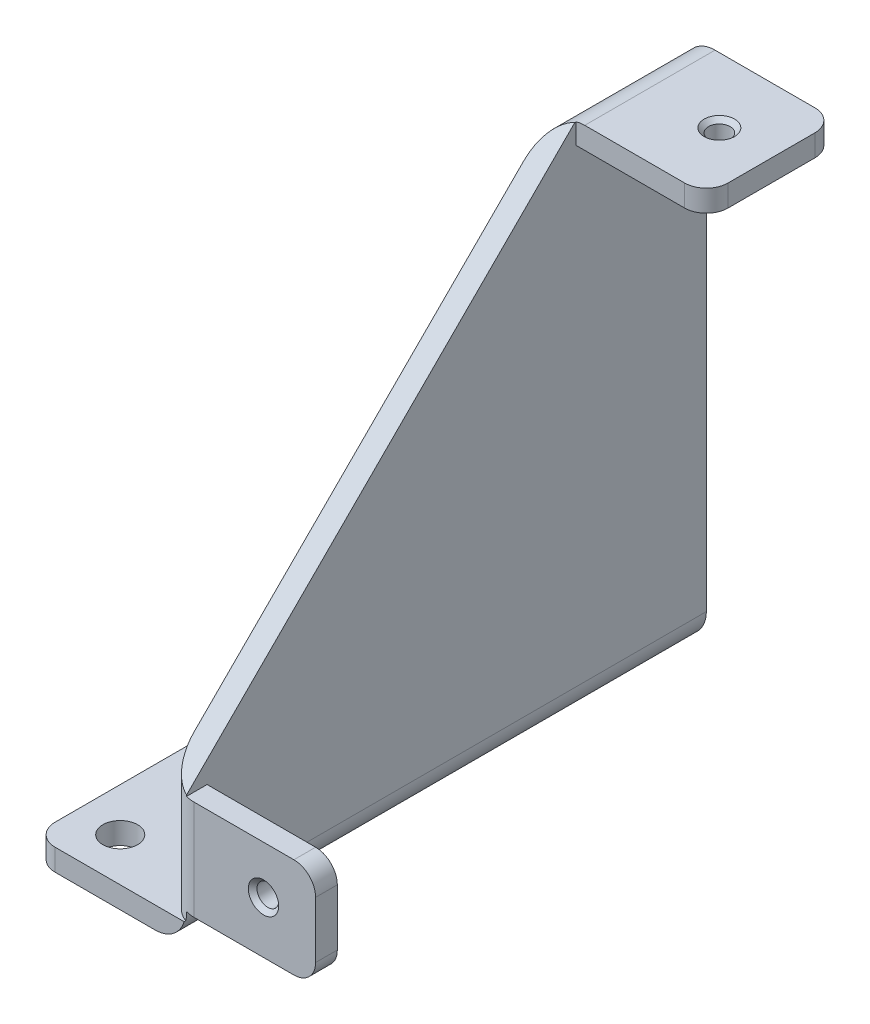
ISO-10303-21;
HEADER;
FILE_DESCRIPTION(('STEP AP214'),'2;1');
FILE_NAME('part.step','',(''),(''),'','','');
FILE_SCHEMA(('AUTOMOTIVE_DESIGN { 1 0 10303 214 1 1 1 1 }'));
ENDSEC;
DATA;
#1=APPLICATION_CONTEXT('core data for automotive mechanical design processes');
#2=APPLICATION_PROTOCOL_DEFINITION('international standard','automotive_design',2000,#1);
#3=PRODUCT_CONTEXT('',#1,'mechanical');
#4=PRODUCT('Part','Part','',(#3));
#5=PRODUCT_RELATED_PRODUCT_CATEGORY('part','',(#4));
#6=PRODUCT_DEFINITION_FORMATION('','',#4);
#7=PRODUCT_DEFINITION_CONTEXT('part definition',#1,'design');
#8=PRODUCT_DEFINITION('design','',#6,#7);
#9=PRODUCT_DEFINITION_SHAPE('','',#8);
#10=(LENGTH_UNIT() NAMED_UNIT(*) SI_UNIT(.MILLI.,.METRE.));
#11=(NAMED_UNIT(*) PLANE_ANGLE_UNIT() SI_UNIT($,.RADIAN.));
#12=(NAMED_UNIT(*) SI_UNIT($,.STERADIAN.) SOLID_ANGLE_UNIT());
#13=UNCERTAINTY_MEASURE_WITH_UNIT(LENGTH_MEASURE(1.E-05),#10,'distance_accuracy_value','');
#14=(GEOMETRIC_REPRESENTATION_CONTEXT(3) GLOBAL_UNCERTAINTY_ASSIGNED_CONTEXT((#13)) GLOBAL_UNIT_ASSIGNED_CONTEXT((#10,
#11,#12)) REPRESENTATION_CONTEXT('',''));
#15=CARTESIAN_POINT('',(0.,0.,0.));
#16=DIRECTION('',(0.,0.,1.));
#17=DIRECTION('',(1.,0.,0.));
#18=AXIS2_PLACEMENT_3D('',#15,#16,#17);
#19=CARTESIAN_POINT('',(5.,30.,120.));
#20=DIRECTION('',(0.,0.,-1.));
#21=DIRECTION('',(-1.,0.,0.));
#22=AXIS2_PLACEMENT_3D('',#19,#20,#21);
#23=PLANE('',#22);
#24=CARTESIAN_POINT('',(23.,19.,120.));
#25=DIRECTION('',(0.,0.,1.));
#26=DIRECTION('',(1.,0.,0.));
#27=AXIS2_PLACEMENT_3D('',#24,#25,#26);
#28=CIRCLE('',#27,3.5);
#29=CARTESIAN_POINT('',(26.5,19.,120.));
#30=VERTEX_POINT('',#29);
#31=EDGE_CURVE('E503',#30,#30,#28,.T.);
#32=ORIENTED_EDGE('',*,*,#31,.F.);
#33=EDGE_LOOP('',(#32));
#34=FACE_BOUND('',#33,.T.);
#35=DIRECTION('',(0.,-1.,0.));
#36=VECTOR('',#35,1.);
#37=CARTESIAN_POINT('',(35.,30.,120.));
#38=LINE('',#37,#36);
#39=CARTESIAN_POINT('',(35.,25.,120.));
#40=VERTEX_POINT('',#39);
#41=CARTESIAN_POINT('',(35.,12.,120.));
#42=VERTEX_POINT('',#41);
#43=EDGE_CURVE('E234',#40,#42,#38,.T.);
#44=ORIENTED_EDGE('',*,*,#43,.F.);
#45=CARTESIAN_POINT('',(30.,25.,120.));
#46=DIRECTION('',(0.,0.,-1.));
#47=DIRECTION('',(-1.,0.,0.));
#48=AXIS2_PLACEMENT_3D('',#45,#46,#47);
#49=CIRCLE('',#48,5.);
#50=CARTESIAN_POINT('',(30.,30.,120.));
#51=VERTEX_POINT('',#50);
#52=EDGE_CURVE('E447',#40,#51,#49,.F.);
#53=ORIENTED_EDGE('',*,*,#52,.T.);
#54=DIRECTION('',(-1.,0.,0.));
#55=VECTOR('',#54,1.);
#56=CARTESIAN_POINT('',(35.,30.,120.));
#57=LINE('',#56,#55);
#58=CARTESIAN_POINT('',(7.,30.,120.));
#59=VERTEX_POINT('',#58);
#60=EDGE_CURVE('E242',#51,#59,#57,.T.);
#61=ORIENTED_EDGE('',*,*,#60,.T.);
#62=DIRECTION('',(0.,-1.,0.));
#63=VECTOR('',#62,1.);
#64=CARTESIAN_POINT('',(7.,30.,120.));
#65=LINE('',#64,#63);
#66=CARTESIAN_POINT('',(7.,7.,120.));
#67=VERTEX_POINT('',#66);
#68=EDGE_CURVE('E271',#59,#67,#65,.T.);
#69=ORIENTED_EDGE('',*,*,#68,.T.);
#70=DIRECTION('',(-1.,0.,0.));
#71=VECTOR('',#70,1.);
#72=CARTESIAN_POINT('',(35.,7.,120.));
#73=LINE('',#72,#71);
#74=CARTESIAN_POINT('',(30.,7.,120.));
#75=VERTEX_POINT('',#74);
#76=EDGE_CURVE('E205',#75,#67,#73,.T.);
#77=ORIENTED_EDGE('',*,*,#76,.F.);
#78=CARTESIAN_POINT('',(30.,12.,120.));
#79=DIRECTION('',(0.,0.,-1.));
#80=DIRECTION('',(-1.,0.,0.));
#81=AXIS2_PLACEMENT_3D('',#78,#79,#80);
#82=CIRCLE('',#81,5.);
#83=EDGE_CURVE('E445',#75,#42,#82,.F.);
#84=ORIENTED_EDGE('',*,*,#83,.T.);
#85=EDGE_LOOP('',(#44,#53,#61,#69,#77,#84));
#86=FACE_BOUND('',#85,.T.);
#87=ADVANCED_FACE('F38',(#34,#86),#23,.F.);
#88=CARTESIAN_POINT('',(5.,0.,0.));
#89=DIRECTION('',(1.,0.,0.));
#90=DIRECTION('',(0.,0.,-1.));
#91=AXIS2_PLACEMENT_3D('',#88,#89,#90);
#92=PLANE('',#91);
#93=DIRECTION('',(0.,-1.,0.));
#94=VECTOR('',#93,1.);
#95=CARTESIAN_POINT('',(5.,120.,30.));
#96=LINE('',#95,#94);
#97=CARTESIAN_POINT('',(5.,119.708203932499,30.));
#98=VERTEX_POINT('',#97);
#99=CARTESIAN_POINT('',(5.,115.,30.));
#100=VERTEX_POINT('',#99);
#101=EDGE_CURVE('E485',#98,#100,#96,.T.);
#102=ORIENTED_EDGE('',*,*,#101,.F.);
#103=DIRECTION('',(0.,0.,1.));
#104=VECTOR('',#103,1.);
#105=CARTESIAN_POINT('',(5.,119.708203932499,30.));
#106=LINE('',#105,#104);
#107=CARTESIAN_POINT('',(5.,119.708203932499,30.2917960675006));
#108=VERTEX_POINT('',#107);
#109=EDGE_CURVE('E385',#98,#108,#106,.T.);
#110=ORIENTED_EDGE('',*,*,#109,.T.);
#111=DIRECTION('',(0.,-0.707106781186548,0.707106781186548));
#112=VECTOR('',#111,1.);
#113=CARTESIAN_POINT('',(5.,120.,30.));
#114=LINE('',#113,#112);
#115=CARTESIAN_POINT('',(5.,30.2917960675007,119.708203932499));
#116=VERTEX_POINT('',#115);
#117=EDGE_CURVE('E394',#108,#116,#114,.T.);
#118=ORIENTED_EDGE('',*,*,#117,.T.);
#119=DIRECTION('',(0.,-1.,0.));
#120=VECTOR('',#119,1.);
#121=CARTESIAN_POINT('',(5.,30.2917960675006,119.708203932499));
#122=LINE('',#121,#120);
#123=CARTESIAN_POINT('',(5.,30.,119.708203932499));
#124=VERTEX_POINT('',#123);
#125=EDGE_CURVE('E383',#116,#124,#122,.T.);
#126=ORIENTED_EDGE('',*,*,#125,.T.);
#127=DIRECTION('',(0.,0.,1.));
#128=VECTOR('',#127,1.);
#129=CARTESIAN_POINT('',(5.,30.,120.));
#130=LINE('',#129,#128);
#131=CARTESIAN_POINT('',(5.,30.,115.));
#132=VERTEX_POINT('',#131);
#133=EDGE_CURVE('E231',#132,#124,#130,.T.);
#134=ORIENTED_EDGE('',*,*,#133,.F.);
#135=DIRECTION('',(0.,1.,0.));
#136=VECTOR('',#135,1.);
#137=CARTESIAN_POINT('',(5.,30.,115.));
#138=LINE('',#137,#136);
#139=CARTESIAN_POINT('',(5.,7.,115.));
#140=VERTEX_POINT('',#139);
#141=EDGE_CURVE('E200',#140,#132,#138,.T.);
#142=ORIENTED_EDGE('',*,*,#141,.F.);
#143=DIRECTION('',(0.,0.,-1.));
#144=VECTOR('',#143,1.);
#145=CARTESIAN_POINT('',(5.,7.,0.));
#146=LINE('',#145,#144);
#147=CARTESIAN_POINT('',(5.,7.,0.));
#148=VERTEX_POINT('',#147);
#149=EDGE_CURVE('E218',#140,#148,#146,.T.);
#150=ORIENTED_EDGE('',*,*,#149,.T.);
#151=DIRECTION('',(0.,1.,0.));
#152=VECTOR('',#151,1.);
#153=CARTESIAN_POINT('',(5.,0.,0.));
#154=LINE('',#153,#152);
#155=CARTESIAN_POINT('',(5.,115.,0.));
#156=VERTEX_POINT('',#155);
#157=EDGE_CURVE('E256',#148,#156,#154,.T.);
#158=ORIENTED_EDGE('',*,*,#157,.T.);
#159=DIRECTION('',(0.,0.,-1.));
#160=VECTOR('',#159,1.);
#161=CARTESIAN_POINT('',(5.,115.,0.));
#162=LINE('',#161,#160);
#163=EDGE_CURVE('E481',#100,#156,#162,.T.);
#164=ORIENTED_EDGE('',*,*,#163,.F.);
#165=EDGE_LOOP('',(#102,#110,#118,#126,#134,#142,#150,#158,#164));
#166=FACE_BOUND('',#165,.T.);
#167=ADVANCED_FACE('F229',(#166),#92,.T.);
#168=CARTESIAN_POINT('',(0.,0.,0.));
#169=DIRECTION('',(1.,0.,0.));
#170=DIRECTION('',(0.,0.,-1.));
#171=AXIS2_PLACEMENT_3D('',#168,#169,#170);
#172=PLANE('',#171);
#173=DIRECTION('',(0.,-0.707106781186548,0.707106781186548));
#174=VECTOR('',#173,1.);
#175=CARTESIAN_POINT('',(0.,120.,30.));
#176=LINE('',#175,#174);
#177=CARTESIAN_POINT('',(0.,113.,37.));
#178=VERTEX_POINT('',#177);
#179=CARTESIAN_POINT('',(0.,37.,113.));
#180=VERTEX_POINT('',#179);
#181=EDGE_CURVE('E393',#178,#180,#176,.T.);
#182=ORIENTED_EDGE('',*,*,#181,.F.);
#183=DIRECTION('',(0.,0.,1.));
#184=VECTOR('',#183,1.);
#185=CARTESIAN_POINT('',(0.,113.,0.));
#186=LINE('',#185,#184);
#187=CARTESIAN_POINT('',(0.,113.,0.));
#188=VERTEX_POINT('',#187);
#189=EDGE_CURVE('E266',#178,#188,#186,.F.);
#190=ORIENTED_EDGE('',*,*,#189,.T.);
#191=DIRECTION('',(0.,1.,0.));
#192=VECTOR('',#191,1.);
#193=CARTESIAN_POINT('',(0.,0.,0.));
#194=LINE('',#193,#192);
#195=CARTESIAN_POINT('',(0.,5.,0.));
#196=VERTEX_POINT('',#195);
#197=EDGE_CURVE('E351',#196,#188,#194,.T.);
#198=ORIENTED_EDGE('',*,*,#197,.F.);
#199=DIRECTION('',(0.,0.,-1.));
#200=VECTOR('',#199,1.);
#201=CARTESIAN_POINT('',(0.,5.,0.));
#202=LINE('',#201,#200);
#203=CARTESIAN_POINT('',(0.,5.,113.));
#204=VERTEX_POINT('',#203);
#205=EDGE_CURVE('E246',#204,#196,#202,.T.);
#206=ORIENTED_EDGE('',*,*,#205,.F.);
#207=DIRECTION('',(0.,-1.,0.));
#208=VECTOR('',#207,1.);
#209=CARTESIAN_POINT('',(0.,0.,113.));
#210=LINE('',#209,#208);
#211=EDGE_CURVE('E264',#204,#180,#210,.F.);
#212=ORIENTED_EDGE('',*,*,#211,.T.);
#213=EDGE_LOOP('',(#182,#190,#198,#206,#212));
#214=FACE_BOUND('',#213,.T.);
#215=ADVANCED_FACE('F329',(#214),#172,.F.);
#216=CARTESIAN_POINT('',(5.,0.,120.));
#217=DIRECTION('',(0.,1.,0.));
#218=DIRECTION('',(0.,0.,1.));
#219=AXIS2_PLACEMENT_3D('',#216,#217,#218);
#220=PLANE('',#219);
#221=CARTESIAN_POINT('',(-20.,0.,110.));
#222=DIRECTION('',(0.,1.,0.));
#223=DIRECTION('',(0.,0.,1.));
#224=AXIS2_PLACEMENT_3D('',#221,#222,#223);
#225=CIRCLE('',#224,4.);
#226=CARTESIAN_POINT('',(-20.,0.,114.));
#227=VERTEX_POINT('',#226);
#228=EDGE_CURVE('E510',#227,#227,#225,.T.);
#229=ORIENTED_EDGE('',*,*,#228,.T.);
#230=EDGE_LOOP('',(#229));
#231=FACE_BOUND('',#230,.T.);
#232=CARTESIAN_POINT('',(-20.,0.,9.99999999999999));
#233=DIRECTION('',(0.,1.,0.));
#234=DIRECTION('',(0.,0.,1.));
#235=AXIS2_PLACEMENT_3D('',#232,#233,#234);
#236=CIRCLE('',#235,4.);
#237=CARTESIAN_POINT('',(-20.,0.,14.));
#238=VERTEX_POINT('',#237);
#239=EDGE_CURVE('E506',#238,#238,#236,.T.);
#240=ORIENTED_EDGE('',*,*,#239,.T.);
#241=EDGE_LOOP('',(#240));
#242=FACE_BOUND('',#241,.T.);
#243=DIRECTION('',(0.,0.,1.));
#244=VECTOR('',#243,1.);
#245=CARTESIAN_POINT('',(-30.,0.,0.));
#246=LINE('',#245,#244);
#247=CARTESIAN_POINT('',(-30.,0.,5.));
#248=VERTEX_POINT('',#247);
#249=CARTESIAN_POINT('',(-30.,0.,115.));
#250=VERTEX_POINT('',#249);
#251=EDGE_CURVE('E247',#248,#250,#246,.T.);
#252=ORIENTED_EDGE('',*,*,#251,.F.);
#253=CARTESIAN_POINT('',(-25.,0.,5.));
#254=DIRECTION('',(0.,1.,0.));
#255=DIRECTION('',(0.,0.,1.));
#256=AXIS2_PLACEMENT_3D('',#253,#254,#255);
#257=CIRCLE('',#256,5.);
#258=CARTESIAN_POINT('',(-25.,0.,0.));
#259=VERTEX_POINT('',#258);
#260=EDGE_CURVE('E360',#248,#259,#257,.F.);
#261=ORIENTED_EDGE('',*,*,#260,.T.);
#262=DIRECTION('',(-1.,0.,0.));
#263=VECTOR('',#262,1.);
#264=CARTESIAN_POINT('',(5.,0.,0.));
#265=LINE('',#264,#263);
#266=CARTESIAN_POINT('',(-2.,0.,0.));
#267=VERTEX_POINT('',#266);
#268=EDGE_CURVE('E226',#267,#259,#265,.T.);
#269=ORIENTED_EDGE('',*,*,#268,.F.);
#270=DIRECTION('',(0.,0.,-1.));
#271=VECTOR('',#270,1.);
#272=CARTESIAN_POINT('',(-2.,0.,120.));
#273=LINE('',#272,#271);
#274=CARTESIAN_POINT('',(-2.,0.,120.));
#275=VERTEX_POINT('',#274);
#276=EDGE_CURVE('E375',#267,#275,#273,.F.);
#277=ORIENTED_EDGE('',*,*,#276,.T.);
#278=DIRECTION('',(-1.,0.,0.));
#279=VECTOR('',#278,1.);
#280=CARTESIAN_POINT('',(5.,0.,120.));
#281=LINE('',#280,#279);
#282=CARTESIAN_POINT('',(-25.,0.,120.));
#283=VERTEX_POINT('',#282);
#284=EDGE_CURVE('E418',#275,#283,#281,.T.);
#285=ORIENTED_EDGE('',*,*,#284,.T.);
#286=CARTESIAN_POINT('',(-25.,0.,115.));
#287=DIRECTION('',(0.,1.,0.));
#288=DIRECTION('',(0.,0.,1.));
#289=AXIS2_PLACEMENT_3D('',#286,#287,#288);
#290=CIRCLE('',#289,5.);
#291=EDGE_CURVE('E356',#283,#250,#290,.F.);
#292=ORIENTED_EDGE('',*,*,#291,.T.);
#293=EDGE_LOOP('',(#252,#261,#269,#277,#285,#292));
#294=FACE_BOUND('',#293,.T.);
#295=ADVANCED_FACE('F519',(#231,#242,#294),#220,.F.);
#296=CARTESIAN_POINT('',(5.,0.,0.));
#297=DIRECTION('',(0.,0.,1.));
#298=DIRECTION('',(1.,0.,0.));
#299=AXIS2_PLACEMENT_3D('',#296,#297,#298);
#300=PLANE('',#299);
#301=DIRECTION('',(-1.,0.,0.));
#302=VECTOR('',#301,1.);
#303=CARTESIAN_POINT('',(5.,120.,0.));
#304=LINE('',#303,#302);
#305=CARTESIAN_POINT('',(30.,120.,0.));
#306=VERTEX_POINT('',#305);
#307=CARTESIAN_POINT('',(7.,120.,0.));
#308=VERTEX_POINT('',#307);
#309=EDGE_CURVE('E410',#306,#308,#304,.T.);
#310=ORIENTED_EDGE('',*,*,#309,.F.);
#311=DIRECTION('',(0.,1.,0.));
#312=VECTOR('',#311,1.);
#313=CARTESIAN_POINT('',(30.,0.,0.));
#314=LINE('',#313,#312);
#315=CARTESIAN_POINT('',(30.,115.,0.));
#316=VERTEX_POINT('',#315);
#317=EDGE_CURVE('E425',#306,#316,#314,.F.);
#318=ORIENTED_EDGE('',*,*,#317,.T.);
#319=DIRECTION('',(-1.,0.,0.));
#320=VECTOR('',#319,1.);
#321=CARTESIAN_POINT('',(35.,115.,0.));
#322=LINE('',#321,#320);
#323=EDGE_CURVE('E478',#316,#156,#322,.T.);
#324=ORIENTED_EDGE('',*,*,#323,.T.);
#325=ORIENTED_EDGE('',*,*,#157,.F.);
#326=CARTESIAN_POINT('',(-2.,7.,0.));
#327=DIRECTION('',(0.,0.,1.));
#328=DIRECTION('',(1.,0.,0.));
#329=AXIS2_PLACEMENT_3D('',#326,#327,#328);
#330=CIRCLE('',#329,7.);
#331=EDGE_CURVE('E217',#148,#267,#330,.F.);
#332=ORIENTED_EDGE('',*,*,#331,.T.);
#333=ORIENTED_EDGE('',*,*,#268,.T.);
#334=DIRECTION('',(0.,-1.,0.));
#335=VECTOR('',#334,1.);
#336=CARTESIAN_POINT('',(-25.,0.,0.));
#337=LINE('',#336,#335);
#338=CARTESIAN_POINT('',(-25.,5.,0.));
#339=VERTEX_POINT('',#338);
#340=EDGE_CURVE('E423',#259,#339,#337,.F.);
#341=ORIENTED_EDGE('',*,*,#340,.T.);
#342=DIRECTION('',(1.,0.,0.));
#343=VECTOR('',#342,1.);
#344=CARTESIAN_POINT('',(-30.,5.,0.));
#345=LINE('',#344,#343);
#346=EDGE_CURVE('E253',#339,#196,#345,.T.);
#347=ORIENTED_EDGE('',*,*,#346,.T.);
#348=ORIENTED_EDGE('',*,*,#197,.T.);
#349=CARTESIAN_POINT('',(7.,113.,0.));
#350=DIRECTION('',(0.,0.,1.));
#351=DIRECTION('',(1.,0.,0.));
#352=AXIS2_PLACEMENT_3D('',#349,#350,#351);
#353=CIRCLE('',#352,7.);
#354=EDGE_CURVE('E268',#188,#308,#353,.F.);
#355=ORIENTED_EDGE('',*,*,#354,.T.);
#356=EDGE_LOOP('',(#310,#318,#324,#325,#332,#333,#341,#347,#348,#355));
#357=FACE_BOUND('',#356,.T.);
#358=ADVANCED_FACE('F409',(#357),#300,.F.);
#359=CARTESIAN_POINT('',(5.,120.,0.));
#360=DIRECTION('',(0.,-1.,0.));
#361=DIRECTION('',(0.,0.,-1.));
#362=AXIS2_PLACEMENT_3D('',#359,#360,#361);
#363=PLANE('',#362);
#364=CARTESIAN_POINT('',(23.,120.,15.));
#365=DIRECTION('',(0.,1.,0.));
#366=DIRECTION('',(0.,0.,1.));
#367=AXIS2_PLACEMENT_3D('',#364,#365,#366);
#368=CIRCLE('',#367,3.5);
#369=CARTESIAN_POINT('',(23.,120.,18.5));
#370=VERTEX_POINT('',#369);
#371=EDGE_CURVE('E496',#370,#370,#368,.T.);
#372=ORIENTED_EDGE('',*,*,#371,.F.);
#373=EDGE_LOOP('',(#372));
#374=FACE_BOUND('',#373,.T.);
#375=DIRECTION('',(0.,0.,1.));
#376=VECTOR('',#375,1.);
#377=CARTESIAN_POINT('',(35.,120.,0.));
#378=LINE('',#377,#376);
#379=CARTESIAN_POINT('',(35.,120.,5.));
#380=VERTEX_POINT('',#379);
#381=CARTESIAN_POINT('',(35.,120.,25.));
#382=VERTEX_POINT('',#381);
#383=EDGE_CURVE('E484',#380,#382,#378,.T.);
#384=ORIENTED_EDGE('',*,*,#383,.F.);
#385=CARTESIAN_POINT('',(30.,120.,5.));
#386=DIRECTION('',(0.,-1.,0.));
#387=DIRECTION('',(0.,0.,-1.));
#388=AXIS2_PLACEMENT_3D('',#385,#386,#387);
#389=CIRCLE('',#388,5.);
#390=EDGE_CURVE('E426',#380,#306,#389,.F.);
#391=ORIENTED_EDGE('',*,*,#390,.T.);
#392=ORIENTED_EDGE('',*,*,#309,.T.);
#393=DIRECTION('',(0.,0.,1.));
#394=VECTOR('',#393,1.);
#395=CARTESIAN_POINT('',(7.,120.,0.));
#396=LINE('',#395,#394);
#397=CARTESIAN_POINT('',(7.,120.,30.));
#398=VERTEX_POINT('',#397);
#399=EDGE_CURVE('E378',#308,#398,#396,.T.);
#400=ORIENTED_EDGE('',*,*,#399,.T.);
#401=DIRECTION('',(-1.,0.,0.));
#402=VECTOR('',#401,1.);
#403=CARTESIAN_POINT('',(35.,120.,30.));
#404=LINE('',#403,#402);
#405=CARTESIAN_POINT('',(30.,120.,30.));
#406=VERTEX_POINT('',#405);
#407=EDGE_CURVE('E232',#406,#398,#404,.T.);
#408=ORIENTED_EDGE('',*,*,#407,.F.);
#409=CARTESIAN_POINT('',(30.,120.,25.));
#410=DIRECTION('',(0.,-1.,0.));
#411=DIRECTION('',(0.,0.,-1.));
#412=AXIS2_PLACEMENT_3D('',#409,#410,#411);
#413=CIRCLE('',#412,5.);
#414=EDGE_CURVE('E430',#406,#382,#413,.F.);
#415=ORIENTED_EDGE('',*,*,#414,.T.);
#416=EDGE_LOOP('',(#384,#391,#392,#400,#408,#415));
#417=FACE_BOUND('',#416,.T.);
#418=ADVANCED_FACE('F345',(#374,#417),#363,.F.);
#419=CARTESIAN_POINT('',(5.,120.,30.));
#420=DIRECTION('',(0.,-0.707106781186548,-0.707106781186548));
#421=DIRECTION('',(0.,0.707106781186548,-0.707106781186548));
#422=AXIS2_PLACEMENT_3D('',#419,#420,#421);
#423=PLANE('',#422);
#424=ORIENTED_EDGE('',*,*,#117,.F.);
#425=CARTESIAN_POINT('',(7.,113.,37.));
#426=DIRECTION('',(0.,-0.707106781186548,-0.707106781186548));
#427=DIRECTION('',(0.,-0.707106781186548,0.707106781186548));
#428=AXIS2_PLACEMENT_3D('',#425,#426,#427);
#429=ELLIPSE('',#428,9.89949493661167,7.);
#430=EDGE_CURVE('E262',#108,#178,#429,.F.);
#431=ORIENTED_EDGE('',*,*,#430,.T.);
#432=ORIENTED_EDGE('',*,*,#181,.T.);
#433=CARTESIAN_POINT('',(7.,37.,113.));
#434=DIRECTION('',(0.,-0.707106781186548,-0.707106781186548));
#435=DIRECTION('',(0.,-0.707106781186548,0.707106781186548));
#436=AXIS2_PLACEMENT_3D('',#433,#434,#435);
#437=ELLIPSE('',#436,9.89949493661167,7.);
#438=EDGE_CURVE('E386',#180,#116,#437,.F.);
#439=ORIENTED_EDGE('',*,*,#438,.T.);
#440=EDGE_LOOP('',(#424,#431,#432,#439));
#441=FACE_BOUND('',#440,.T.);
#442=ADVANCED_FACE('F337',(#441),#423,.F.);
#443=DIRECTION('',(1.,0.,0.));
#444=VECTOR('',#443,1.);
#445=CARTESIAN_POINT('',(-30.,5.,120.));
#446=LINE('',#445,#444);
#447=CARTESIAN_POINT('',(-25.,5.,120.));
#448=VERTEX_POINT('',#447);
#449=CARTESIAN_POINT('',(4.70820393249937,5.,120.));
#450=VERTEX_POINT('',#449);
#451=EDGE_CURVE('E348',#448,#450,#446,.T.);
#452=ORIENTED_EDGE('',*,*,#451,.F.);
#453=DIRECTION('',(0.,1.,0.));
#454=VECTOR('',#453,1.);
#455=CARTESIAN_POINT('',(-25.,30.,120.));
#456=LINE('',#455,#454);
#457=EDGE_CURVE('E11',#448,#283,#456,.F.);
#458=ORIENTED_EDGE('',*,*,#457,.T.);
#459=ORIENTED_EDGE('',*,*,#284,.F.);
#460=CARTESIAN_POINT('',(-2.,7.,120.));
#461=DIRECTION('',(0.,0.,-1.));
#462=DIRECTION('',(-1.,0.,0.));
#463=AXIS2_PLACEMENT_3D('',#460,#461,#462);
#464=CIRCLE('',#463,7.);
#465=EDGE_CURVE('E350',#275,#450,#464,.F.);
#466=ORIENTED_EDGE('',*,*,#465,.T.);
#467=EDGE_LOOP('',(#452,#458,#459,#466));
#468=FACE_BOUND('',#467,.T.);
#469=ADVANCED_FACE('F325',(#468),#23,.F.);
#470=CARTESIAN_POINT('',(-30.,5.,0.));
#471=DIRECTION('',(0.,-1.,0.));
#472=DIRECTION('',(0.,0.,-1.));
#473=AXIS2_PLACEMENT_3D('',#470,#471,#472);
#474=PLANE('',#473);
#475=CARTESIAN_POINT('',(-20.,5.,110.));
#476=DIRECTION('',(0.,1.,0.));
#477=DIRECTION('',(0.,0.,1.));
#478=AXIS2_PLACEMENT_3D('',#475,#476,#477);
#479=CIRCLE('',#478,4.);
#480=CARTESIAN_POINT('',(-20.,5.,114.));
#481=VERTEX_POINT('',#480);
#482=EDGE_CURVE('E513',#481,#481,#479,.T.);
#483=ORIENTED_EDGE('',*,*,#482,.F.);
#484=EDGE_LOOP('',(#483));
#485=FACE_BOUND('',#484,.T.);
#486=CARTESIAN_POINT('',(-20.,5.,9.99999999999999));
#487=DIRECTION('',(0.,1.,0.));
#488=DIRECTION('',(0.,0.,1.));
#489=AXIS2_PLACEMENT_3D('',#486,#487,#488);
#490=CIRCLE('',#489,4.);
#491=CARTESIAN_POINT('',(-20.,5.,14.));
#492=VERTEX_POINT('',#491);
#493=EDGE_CURVE('E507',#492,#492,#490,.T.);
#494=ORIENTED_EDGE('',*,*,#493,.F.);
#495=EDGE_LOOP('',(#494));
#496=FACE_BOUND('',#495,.T.);
#497=ORIENTED_EDGE('',*,*,#346,.F.);
#498=CARTESIAN_POINT('',(-25.,5.,5.));
#499=DIRECTION('',(0.,-1.,0.));
#500=DIRECTION('',(0.,0.,-1.));
#501=AXIS2_PLACEMENT_3D('',#498,#499,#500);
#502=CIRCLE('',#501,5.);
#503=CARTESIAN_POINT('',(-30.,5.,5.));
#504=VERTEX_POINT('',#503);
#505=EDGE_CURVE('E46',#339,#504,#502,.F.);
#506=ORIENTED_EDGE('',*,*,#505,.T.);
#507=DIRECTION('',(0.,0.,-1.));
#508=VECTOR('',#507,1.);
#509=CARTESIAN_POINT('',(-30.,5.,0.));
#510=LINE('',#509,#508);
#511=CARTESIAN_POINT('',(-30.,5.,115.));
#512=VERTEX_POINT('',#511);
#513=EDGE_CURVE('E250',#512,#504,#510,.T.);
#514=ORIENTED_EDGE('',*,*,#513,.F.);
#515=CARTESIAN_POINT('',(-25.,5.,115.));
#516=DIRECTION('',(0.,-1.,0.));
#517=DIRECTION('',(0.,0.,-1.));
#518=AXIS2_PLACEMENT_3D('',#515,#516,#517);
#519=CIRCLE('',#518,5.);
#520=EDGE_CURVE('E53',#512,#448,#519,.F.);
#521=ORIENTED_EDGE('',*,*,#520,.T.);
#522=ORIENTED_EDGE('',*,*,#451,.T.);
#523=DIRECTION('',(0.,0.,1.));
#524=VECTOR('',#523,1.);
#525=CARTESIAN_POINT('',(4.70820393249937,5.,119.614202203213));
#526=LINE('',#525,#524);
#527=CARTESIAN_POINT('',(4.70820393249937,5.,119.614202203213));
#528=VERTEX_POINT('',#527);
#529=EDGE_CURVE('E275',#528,#450,#526,.T.);
#530=ORIENTED_EDGE('',*,*,#529,.F.);
#531=CARTESIAN_POINT('',(7.,5.,113.));
#532=DIRECTION('',(0.,-1.,0.));
#533=DIRECTION('',(0.,0.,-1.));
#534=AXIS2_PLACEMENT_3D('',#531,#532,#533);
#535=CIRCLE('',#534,7.);
#536=EDGE_CURVE('E457',#528,#204,#535,.T.);
#537=ORIENTED_EDGE('',*,*,#536,.T.);
#538=ORIENTED_EDGE('',*,*,#205,.T.);
#539=EDGE_LOOP('',(#497,#506,#514,#521,#522,#530,#537,#538));
#540=FACE_BOUND('',#539,.T.);
#541=ADVANCED_FACE('F336',(#485,#496,#540),#474,.F.);
#542=CARTESIAN_POINT('',(-30.,5.,0.));
#543=DIRECTION('',(1.,0.,0.));
#544=DIRECTION('',(0.,0.,-1.));
#545=AXIS2_PLACEMENT_3D('',#542,#543,#544);
#546=PLANE('',#545);
#547=ORIENTED_EDGE('',*,*,#513,.T.);
#548=DIRECTION('',(0.,-1.,0.));
#549=VECTOR('',#548,1.);
#550=CARTESIAN_POINT('',(-30.,5.,5.));
#551=LINE('',#550,#549);
#552=EDGE_CURVE('E361',#504,#248,#551,.T.);
#553=ORIENTED_EDGE('',*,*,#552,.T.);
#554=ORIENTED_EDGE('',*,*,#251,.T.);
#555=DIRECTION('',(0.,1.,0.));
#556=VECTOR('',#555,1.);
#557=CARTESIAN_POINT('',(-30.,5.,115.));
#558=LINE('',#557,#556);
#559=EDGE_CURVE('E357',#250,#512,#558,.T.);
#560=ORIENTED_EDGE('',*,*,#559,.T.);
#561=EDGE_LOOP('',(#547,#553,#554,#560));
#562=FACE_BOUND('',#561,.T.);
#563=ADVANCED_FACE('F342',(#562),#546,.F.);
#564=CARTESIAN_POINT('',(-2.,7.,0.));
#565=DIRECTION('',(0.,0.,1.));
#566=DIRECTION('',(1.,0.,0.));
#567=AXIS2_PLACEMENT_3D('',#564,#565,#566);
#568=CYLINDRICAL_SURFACE('',#567,7.);
#569=CARTESIAN_POINT('',(5.,7.,119.708203932499));
#570=VERTEX_POINT('',#569);
#571=EDGE_CURVE('E209',#570,#140,#146,.T.);
#572=ORIENTED_EDGE('',*,*,#571,.F.);
#573=CARTESIAN_POINT('',(5.,7.,119.708203932499));
#574=CARTESIAN_POINT('',(5.00000031619453,6.90829199954778,119.708201478872));
#575=CARTESIAN_POINT('',(4.9981975548509,6.81659344407059,119.707666853248));
#576=CARTESIAN_POINT('',(4.9909924907365,6.63335031476654,119.705513362855));
#577=CARTESIAN_POINT('',(4.98559017513516,6.54180574148971,119.703894494222));
#578=CARTESIAN_POINT('',(4.96409425614081,6.26888159504904,119.697411969938));
#579=CARTESIAN_POINT('',(4.94271115070212,6.08792856052908,119.690922809255));
#580=CARTESIAN_POINT('',(4.88594840206102,5.72845632374011,119.673205253329));
#581=CARTESIAN_POINT('',(4.85056838068124,5.54993718736648,119.661976730034));
#582=CARTESIAN_POINT('',(4.78711622543584,5.28435973201892,119.641057007741));
#583=CARTESIAN_POINT('',(4.76413729456127,5.19589814926305,119.633370482114));
#584=CARTESIAN_POINT('',(4.71477476450565,5.02006568493114,119.616526265773));
#585=CARTESIAN_POINT('',(4.68839094176487,4.93269487538699,119.607368478448));
#586=CARTESIAN_POINT('',(4.66033355301158,4.84594406696852,119.59742077761));
#587=B_SPLINE_CURVE_WITH_KNOTS('',3,(#573,#574,#575,#576,#577,#578,#579,#580,#581,#582,#583,
#584,#585,#586),.UNSPECIFIED.,.F.,.F.,(4,2,2,2,2,2,4),(0.,0.275085796476029,0.550172573497164,
1.09650880589969,1.64285980056186,1.91794830264174,2.19305487578948),.UNSPECIFIED.);
#588=EDGE_CURVE('E278',#570,#528,#587,.T.);
#589=ORIENTED_EDGE('',*,*,#588,.T.);
#590=ORIENTED_EDGE('',*,*,#529,.T.);
#591=ORIENTED_EDGE('',*,*,#465,.F.);
#592=ORIENTED_EDGE('',*,*,#276,.F.);
#593=ORIENTED_EDGE('',*,*,#331,.F.);
#594=ORIENTED_EDGE('',*,*,#149,.F.);
#595=EDGE_LOOP('',(#572,#589,#590,#591,#592,#593,#594));
#596=FACE_BOUND('',#595,.T.);
#597=ADVANCED_FACE('F221',(#596),#568,.T.);
#598=CARTESIAN_POINT('',(35.,7.,120.));
#599=DIRECTION('',(0.,1.,0.));
#600=DIRECTION('',(0.,0.,1.));
#601=AXIS2_PLACEMENT_3D('',#598,#599,#600);
#602=PLANE('',#601);
#603=DIRECTION('',(-1.,0.,0.));
#604=VECTOR('',#603,1.);
#605=CARTESIAN_POINT('',(35.,7.,115.));
#606=LINE('',#605,#604);
#607=CARTESIAN_POINT('',(30.,7.,115.));
#608=VERTEX_POINT('',#607);
#609=EDGE_CURVE('E195',#608,#140,#606,.T.);
#610=ORIENTED_EDGE('',*,*,#609,.F.);
#611=DIRECTION('',(0.,0.,-1.));
#612=VECTOR('',#611,1.);
#613=CARTESIAN_POINT('',(30.,7.,120.));
#614=LINE('',#613,#612);
#615=EDGE_CURVE('E454',#608,#75,#614,.F.);
#616=ORIENTED_EDGE('',*,*,#615,.T.);
#617=ORIENTED_EDGE('',*,*,#76,.T.);
#618=CARTESIAN_POINT('',(7.,7.,113.));
#619=DIRECTION('',(0.,1.,0.));
#620=DIRECTION('',(0.,0.,1.));
#621=AXIS2_PLACEMENT_3D('',#618,#619,#620);
#622=CIRCLE('',#621,7.);
#623=EDGE_CURVE('E213',#67,#570,#622,.F.);
#624=ORIENTED_EDGE('',*,*,#623,.T.);
#625=ORIENTED_EDGE('',*,*,#571,.T.);
#626=EDGE_LOOP('',(#610,#616,#617,#624,#625));
#627=FACE_BOUND('',#626,.T.);
#628=ADVANCED_FACE('F211',(#627),#602,.F.);
#629=CARTESIAN_POINT('',(35.,30.,115.));
#630=DIRECTION('',(0.,0.,1.));
#631=DIRECTION('',(1.,0.,0.));
#632=AXIS2_PLACEMENT_3D('',#629,#630,#631);
#633=PLANE('',#632);
#634=CARTESIAN_POINT('',(23.,19.,115.));
#635=DIRECTION('',(0.,0.,1.));
#636=DIRECTION('',(1.,0.,0.));
#637=AXIS2_PLACEMENT_3D('',#634,#635,#636);
#638=CIRCLE('',#637,2.49999999999999);
#639=CARTESIAN_POINT('',(25.5,19.,115.));
#640=VERTEX_POINT('',#639);
#641=EDGE_CURVE('E499',#640,#640,#638,.T.);
#642=ORIENTED_EDGE('',*,*,#641,.T.);
#643=EDGE_LOOP('',(#642));
#644=FACE_BOUND('',#643,.T.);
#645=DIRECTION('',(-1.,0.,0.));
#646=VECTOR('',#645,1.);
#647=CARTESIAN_POINT('',(35.,30.,115.));
#648=LINE('',#647,#646);
#649=CARTESIAN_POINT('',(30.,30.,115.));
#650=VERTEX_POINT('',#649);
#651=EDGE_CURVE('E206',#650,#132,#648,.T.);
#652=ORIENTED_EDGE('',*,*,#651,.F.);
#653=CARTESIAN_POINT('',(30.,25.,115.));
#654=DIRECTION('',(0.,0.,1.));
#655=DIRECTION('',(1.,0.,0.));
#656=AXIS2_PLACEMENT_3D('',#653,#654,#655);
#657=CIRCLE('',#656,5.);
#658=CARTESIAN_POINT('',(35.,25.,115.));
#659=VERTEX_POINT('',#658);
#660=EDGE_CURVE('E452',#650,#659,#657,.F.);
#661=ORIENTED_EDGE('',*,*,#660,.T.);
#662=DIRECTION('',(0.,1.,0.));
#663=VECTOR('',#662,1.);
#664=CARTESIAN_POINT('',(35.,30.,115.));
#665=LINE('',#664,#663);
#666=CARTESIAN_POINT('',(35.,12.,115.));
#667=VERTEX_POINT('',#666);
#668=EDGE_CURVE('E239',#667,#659,#665,.T.);
#669=ORIENTED_EDGE('',*,*,#668,.F.);
#670=CARTESIAN_POINT('',(30.,12.,115.));
#671=DIRECTION('',(0.,0.,1.));
#672=DIRECTION('',(1.,0.,0.));
#673=AXIS2_PLACEMENT_3D('',#670,#671,#672);
#674=CIRCLE('',#673,5.);
#675=EDGE_CURVE('E202',#667,#608,#674,.F.);
#676=ORIENTED_EDGE('',*,*,#675,.T.);
#677=ORIENTED_EDGE('',*,*,#609,.T.);
#678=ORIENTED_EDGE('',*,*,#141,.T.);
#679=EDGE_LOOP('',(#652,#661,#669,#676,#677,#678));
#680=FACE_BOUND('',#679,.T.);
#681=ADVANCED_FACE('F198',(#644,#680),#633,.F.);
#682=CARTESIAN_POINT('',(35.,30.,120.));
#683=DIRECTION('',(0.,-1.,0.));
#684=DIRECTION('',(0.,0.,-1.));
#685=AXIS2_PLACEMENT_3D('',#682,#683,#684);
#686=PLANE('',#685);
#687=ORIENTED_EDGE('',*,*,#60,.F.);
#688=DIRECTION('',(0.,0.,1.));
#689=VECTOR('',#688,1.);
#690=CARTESIAN_POINT('',(30.,30.,115.));
#691=LINE('',#690,#689);
#692=EDGE_CURVE('E449',#51,#650,#691,.F.);
#693=ORIENTED_EDGE('',*,*,#692,.T.);
#694=ORIENTED_EDGE('',*,*,#651,.T.);
#695=ORIENTED_EDGE('',*,*,#133,.T.);
#696=CARTESIAN_POINT('',(7.,30.,113.));
#697=DIRECTION('',(0.,-1.,0.));
#698=DIRECTION('',(0.,0.,-1.));
#699=AXIS2_PLACEMENT_3D('',#696,#697,#698);
#700=CIRCLE('',#699,7.);
#701=EDGE_CURVE('E285',#124,#59,#700,.F.);
#702=ORIENTED_EDGE('',*,*,#701,.T.);
#703=EDGE_LOOP('',(#687,#693,#694,#695,#702));
#704=FACE_BOUND('',#703,.T.);
#705=ADVANCED_FACE('F464',(#704),#686,.F.);
#706=CARTESIAN_POINT('',(35.,7.,120.));
#707=DIRECTION('',(1.,0.,0.));
#708=DIRECTION('',(0.,0.,-1.));
#709=AXIS2_PLACEMENT_3D('',#706,#707,#708);
#710=PLANE('',#709);
#711=ORIENTED_EDGE('',*,*,#668,.T.);
#712=DIRECTION('',(0.,0.,1.));
#713=VECTOR('',#712,1.);
#714=CARTESIAN_POINT('',(35.,25.,120.));
#715=LINE('',#714,#713);
#716=EDGE_CURVE('E442',#659,#40,#715,.T.);
#717=ORIENTED_EDGE('',*,*,#716,.T.);
#718=ORIENTED_EDGE('',*,*,#43,.T.);
#719=DIRECTION('',(0.,0.,-1.));
#720=VECTOR('',#719,1.);
#721=CARTESIAN_POINT('',(35.,12.,115.));
#722=LINE('',#721,#720);
#723=EDGE_CURVE('E439',#42,#667,#722,.T.);
#724=ORIENTED_EDGE('',*,*,#723,.T.);
#725=EDGE_LOOP('',(#711,#717,#718,#724));
#726=FACE_BOUND('',#725,.T.);
#727=ADVANCED_FACE('F472',(#726),#710,.T.);
#728=CARTESIAN_POINT('',(35.,120.,30.));
#729=DIRECTION('',(0.,0.,-1.));
#730=DIRECTION('',(-1.,0.,0.));
#731=AXIS2_PLACEMENT_3D('',#728,#729,#730);
#732=PLANE('',#731);
#733=DIRECTION('',(-1.,0.,0.));
#734=VECTOR('',#733,1.);
#735=CARTESIAN_POINT('',(35.,115.,30.));
#736=LINE('',#735,#734);
#737=CARTESIAN_POINT('',(30.,115.,30.));
#738=VERTEX_POINT('',#737);
#739=EDGE_CURVE('E236',#738,#100,#736,.T.);
#740=ORIENTED_EDGE('',*,*,#739,.F.);
#741=DIRECTION('',(0.,-1.,0.));
#742=VECTOR('',#741,1.);
#743=CARTESIAN_POINT('',(30.,120.,30.));
#744=LINE('',#743,#742);
#745=EDGE_CURVE('E437',#738,#406,#744,.F.);
#746=ORIENTED_EDGE('',*,*,#745,.T.);
#747=ORIENTED_EDGE('',*,*,#407,.T.);
#748=CARTESIAN_POINT('',(7.,113.,30.));
#749=DIRECTION('',(0.,0.,-1.));
#750=DIRECTION('',(-1.,0.,0.));
#751=AXIS2_PLACEMENT_3D('',#748,#749,#750);
#752=CIRCLE('',#751,7.);
#753=EDGE_CURVE('E381',#398,#98,#752,.F.);
#754=ORIENTED_EDGE('',*,*,#753,.T.);
#755=ORIENTED_EDGE('',*,*,#101,.T.);
#756=EDGE_LOOP('',(#740,#746,#747,#754,#755));
#757=FACE_BOUND('',#756,.T.);
#758=ADVANCED_FACE('F558',(#757),#732,.F.);
#759=CARTESIAN_POINT('',(35.,115.,0.));
#760=DIRECTION('',(0.,1.,0.));
#761=DIRECTION('',(0.,0.,1.));
#762=AXIS2_PLACEMENT_3D('',#759,#760,#761);
#763=PLANE('',#762);
#764=CARTESIAN_POINT('',(23.,115.,15.));
#765=DIRECTION('',(0.,1.,0.));
#766=DIRECTION('',(0.,0.,1.));
#767=AXIS2_PLACEMENT_3D('',#764,#765,#766);
#768=CIRCLE('',#767,2.49999999999999);
#769=CARTESIAN_POINT('',(23.,115.,17.5));
#770=VERTEX_POINT('',#769);
#771=EDGE_CURVE('E488',#770,#770,#768,.T.);
#772=ORIENTED_EDGE('',*,*,#771,.T.);
#773=EDGE_LOOP('',(#772));
#774=FACE_BOUND('',#773,.T.);
#775=ORIENTED_EDGE('',*,*,#323,.F.);
#776=CARTESIAN_POINT('',(30.,115.,5.));
#777=DIRECTION('',(0.,1.,0.));
#778=DIRECTION('',(0.,0.,1.));
#779=AXIS2_PLACEMENT_3D('',#776,#777,#778);
#780=CIRCLE('',#779,5.);
#781=CARTESIAN_POINT('',(35.,115.,5.));
#782=VERTEX_POINT('',#781);
#783=EDGE_CURVE('E435',#316,#782,#780,.F.);
#784=ORIENTED_EDGE('',*,*,#783,.T.);
#785=DIRECTION('',(0.,0.,-1.));
#786=VECTOR('',#785,1.);
#787=CARTESIAN_POINT('',(35.,115.,0.));
#788=LINE('',#787,#786);
#789=CARTESIAN_POINT('',(35.,115.,25.));
#790=VERTEX_POINT('',#789);
#791=EDGE_CURVE('E480',#790,#782,#788,.T.);
#792=ORIENTED_EDGE('',*,*,#791,.F.);
#793=CARTESIAN_POINT('',(30.,115.,25.));
#794=DIRECTION('',(0.,1.,0.));
#795=DIRECTION('',(0.,0.,1.));
#796=AXIS2_PLACEMENT_3D('',#793,#794,#795);
#797=CIRCLE('',#796,5.);
#798=EDGE_CURVE('E428',#790,#738,#797,.F.);
#799=ORIENTED_EDGE('',*,*,#798,.T.);
#800=ORIENTED_EDGE('',*,*,#739,.T.);
#801=ORIENTED_EDGE('',*,*,#163,.T.);
#802=EDGE_LOOP('',(#775,#784,#792,#799,#800,#801));
#803=FACE_BOUND('',#802,.T.);
#804=ADVANCED_FACE('F554',(#774,#803),#763,.F.);
#805=CARTESIAN_POINT('',(35.,115.,0.));
#806=DIRECTION('',(-1.,0.,0.));
#807=DIRECTION('',(0.,0.,1.));
#808=AXIS2_PLACEMENT_3D('',#805,#806,#807);
#809=PLANE('',#808);
#810=ORIENTED_EDGE('',*,*,#791,.T.);
#811=DIRECTION('',(0.,1.,0.));
#812=VECTOR('',#811,1.);
#813=CARTESIAN_POINT('',(35.,115.,5.));
#814=LINE('',#813,#812);
#815=EDGE_CURVE('E596',#782,#380,#814,.T.);
#816=ORIENTED_EDGE('',*,*,#815,.T.);
#817=ORIENTED_EDGE('',*,*,#383,.T.);
#818=DIRECTION('',(0.,-1.,0.));
#819=VECTOR('',#818,1.);
#820=CARTESIAN_POINT('',(35.,115.,25.));
#821=LINE('',#820,#819);
#822=EDGE_CURVE('E593',#382,#790,#821,.T.);
#823=ORIENTED_EDGE('',*,*,#822,.T.);
#824=EDGE_LOOP('',(#810,#816,#817,#823));
#825=FACE_BOUND('',#824,.T.);
#826=ADVANCED_FACE('F551',(#825),#809,.F.);
#827=CARTESIAN_POINT('',(7.,113.,0.));
#828=DIRECTION('',(0.,0.,1.));
#829=DIRECTION('',(1.,0.,0.));
#830=AXIS2_PLACEMENT_3D('',#827,#828,#829);
#831=CYLINDRICAL_SURFACE('',#830,7.);
#832=ORIENTED_EDGE('',*,*,#354,.F.);
#833=ORIENTED_EDGE('',*,*,#189,.F.);
#834=ORIENTED_EDGE('',*,*,#430,.F.);
#835=ORIENTED_EDGE('',*,*,#109,.F.);
#836=ORIENTED_EDGE('',*,*,#753,.F.);
#837=ORIENTED_EDGE('',*,*,#399,.F.);
#838=EDGE_LOOP('',(#832,#833,#834,#835,#836,#837));
#839=FACE_BOUND('',#838,.T.);
#840=ADVANCED_FACE('F295',(#839),#831,.T.);
#841=CARTESIAN_POINT('',(7.,30.,113.));
#842=DIRECTION('',(0.,-1.,0.));
#843=DIRECTION('',(0.,0.,-1.));
#844=AXIS2_PLACEMENT_3D('',#841,#842,#843);
#845=CYLINDRICAL_SURFACE('',#844,7.);
#846=ORIENTED_EDGE('',*,*,#438,.F.);
#847=ORIENTED_EDGE('',*,*,#211,.F.);
#848=ORIENTED_EDGE('',*,*,#536,.F.);
#849=ORIENTED_EDGE('',*,*,#588,.F.);
#850=ORIENTED_EDGE('',*,*,#623,.F.);
#851=ORIENTED_EDGE('',*,*,#68,.F.);
#852=ORIENTED_EDGE('',*,*,#701,.F.);
#853=ORIENTED_EDGE('',*,*,#125,.F.);
#854=EDGE_LOOP('',(#846,#847,#848,#849,#850,#851,#852,#853));
#855=FACE_BOUND('',#854,.T.);
#856=ADVANCED_FACE('F290',(#855),#845,.T.);
#857=CARTESIAN_POINT('',(23.,120.,15.));
#858=DIRECTION('',(0.,1.,0.));
#859=DIRECTION('',(0.,0.,1.));
#860=AXIS2_PLACEMENT_3D('',#857,#858,#859);
#861=CYLINDRICAL_SURFACE('',#860,2.49999999999999);
#862=CARTESIAN_POINT('',(23.,119.,15.));
#863=DIRECTION('',(0.,1.,0.));
#864=DIRECTION('',(0.,0.,1.));
#865=AXIS2_PLACEMENT_3D('',#862,#863,#864);
#866=CIRCLE('',#865,2.5);
#867=CARTESIAN_POINT('',(23.,119.,17.5));
#868=VERTEX_POINT('',#867);
#869=EDGE_CURVE('E493',#868,#868,#866,.T.);
#870=ORIENTED_EDGE('',*,*,#869,.T.);
#871=EDGE_LOOP('',(#870));
#872=FACE_BOUND('',#871,.T.);
#873=ORIENTED_EDGE('',*,*,#771,.F.);
#874=EDGE_LOOP('',(#873));
#875=FACE_BOUND('',#874,.T.);
#876=ADVANCED_FACE('F294',(#872,#875),#861,.F.);
#877=CARTESIAN_POINT('',(23.,120.,15.));
#878=DIRECTION('',(0.,1.,0.));
#879=DIRECTION('',(0.,0.,1.));
#880=AXIS2_PLACEMENT_3D('',#877,#878,#879);
#881=CONICAL_SURFACE('',#880,3.5,0.785398163397448);
#882=ORIENTED_EDGE('',*,*,#869,.F.);
#883=EDGE_LOOP('',(#882));
#884=FACE_BOUND('',#883,.T.);
#885=ORIENTED_EDGE('',*,*,#371,.T.);
#886=EDGE_LOOP('',(#885));
#887=FACE_BOUND('',#886,.T.);
#888=ADVANCED_FACE('F543',(#884,#887),#881,.F.);
#889=CARTESIAN_POINT('',(23.,19.,120.));
#890=DIRECTION('',(0.,0.,1.));
#891=DIRECTION('',(1.,0.,0.));
#892=AXIS2_PLACEMENT_3D('',#889,#890,#891);
#893=CYLINDRICAL_SURFACE('',#892,2.49999999999999);
#894=CARTESIAN_POINT('',(23.,19.,119.));
#895=DIRECTION('',(0.,0.,1.));
#896=DIRECTION('',(1.,0.,0.));
#897=AXIS2_PLACEMENT_3D('',#894,#895,#896);
#898=CIRCLE('',#897,2.49999999999999);
#899=CARTESIAN_POINT('',(25.5,19.,119.));
#900=VERTEX_POINT('',#899);
#901=EDGE_CURVE('E500',#900,#900,#898,.T.);
#902=ORIENTED_EDGE('',*,*,#901,.T.);
#903=EDGE_LOOP('',(#902));
#904=FACE_BOUND('',#903,.T.);
#905=ORIENTED_EDGE('',*,*,#641,.F.);
#906=EDGE_LOOP('',(#905));
#907=FACE_BOUND('',#906,.T.);
#908=ADVANCED_FACE('F539',(#904,#907),#893,.F.);
#909=CARTESIAN_POINT('',(23.,19.,120.));
#910=DIRECTION('',(0.,0.,1.));
#911=DIRECTION('',(1.,0.,0.));
#912=AXIS2_PLACEMENT_3D('',#909,#910,#911);
#913=CONICAL_SURFACE('',#912,3.5,0.785398163397452);
#914=ORIENTED_EDGE('',*,*,#901,.F.);
#915=EDGE_LOOP('',(#914));
#916=FACE_BOUND('',#915,.T.);
#917=ORIENTED_EDGE('',*,*,#31,.T.);
#918=EDGE_LOOP('',(#917));
#919=FACE_BOUND('',#918,.T.);
#920=ADVANCED_FACE('F301',(#916,#919),#913,.F.);
#921=CARTESIAN_POINT('',(30.,115.,5.));
#922=DIRECTION('',(0.,1.,0.));
#923=DIRECTION('',(0.,0.,1.));
#924=AXIS2_PLACEMENT_3D('',#921,#922,#923);
#925=CYLINDRICAL_SURFACE('',#924,5.);
#926=ORIENTED_EDGE('',*,*,#783,.F.);
#927=ORIENTED_EDGE('',*,*,#317,.F.);
#928=ORIENTED_EDGE('',*,*,#390,.F.);
#929=ORIENTED_EDGE('',*,*,#815,.F.);
#930=EDGE_LOOP('',(#926,#927,#928,#929));
#931=FACE_BOUND('',#930,.T.);
#932=ADVANCED_FACE('F297',(#931),#925,.T.);
#933=CARTESIAN_POINT('',(30.,115.,25.));
#934=DIRECTION('',(0.,-1.,0.));
#935=DIRECTION('',(0.,0.,-1.));
#936=AXIS2_PLACEMENT_3D('',#933,#934,#935);
#937=CYLINDRICAL_SURFACE('',#936,5.);
#938=ORIENTED_EDGE('',*,*,#414,.F.);
#939=ORIENTED_EDGE('',*,*,#745,.F.);
#940=ORIENTED_EDGE('',*,*,#798,.F.);
#941=ORIENTED_EDGE('',*,*,#822,.F.);
#942=EDGE_LOOP('',(#938,#939,#940,#941));
#943=FACE_BOUND('',#942,.T.);
#944=ADVANCED_FACE('F300',(#943),#937,.T.);
#945=CARTESIAN_POINT('',(30.,25.,120.));
#946=DIRECTION('',(0.,0.,-1.));
#947=DIRECTION('',(-1.,0.,0.));
#948=AXIS2_PLACEMENT_3D('',#945,#946,#947);
#949=CYLINDRICAL_SURFACE('',#948,5.);
#950=ORIENTED_EDGE('',*,*,#660,.F.);
#951=ORIENTED_EDGE('',*,*,#692,.F.);
#952=ORIENTED_EDGE('',*,*,#52,.F.);
#953=ORIENTED_EDGE('',*,*,#716,.F.);
#954=EDGE_LOOP('',(#950,#951,#952,#953));
#955=FACE_BOUND('',#954,.T.);
#956=ADVANCED_FACE('F305',(#955),#949,.T.);
#957=CARTESIAN_POINT('',(30.,12.,120.));
#958=DIRECTION('',(0.,0.,1.));
#959=DIRECTION('',(1.,0.,0.));
#960=AXIS2_PLACEMENT_3D('',#957,#958,#959);
#961=CYLINDRICAL_SURFACE('',#960,5.);
#962=ORIENTED_EDGE('',*,*,#83,.F.);
#963=ORIENTED_EDGE('',*,*,#615,.F.);
#964=ORIENTED_EDGE('',*,*,#675,.F.);
#965=ORIENTED_EDGE('',*,*,#723,.F.);
#966=EDGE_LOOP('',(#962,#963,#964,#965));
#967=FACE_BOUND('',#966,.T.);
#968=ADVANCED_FACE('F309',(#967),#961,.T.);
#969=CARTESIAN_POINT('',(-25.,5.,5.));
#970=DIRECTION('',(0.,-1.,0.));
#971=DIRECTION('',(0.,0.,-1.));
#972=AXIS2_PLACEMENT_3D('',#969,#970,#971);
#973=CYLINDRICAL_SURFACE('',#972,5.);
#974=ORIENTED_EDGE('',*,*,#505,.F.);
#975=ORIENTED_EDGE('',*,*,#340,.F.);
#976=ORIENTED_EDGE('',*,*,#260,.F.);
#977=ORIENTED_EDGE('',*,*,#552,.F.);
#978=EDGE_LOOP('',(#974,#975,#976,#977));
#979=FACE_BOUND('',#978,.T.);
#980=ADVANCED_FACE('F312',(#979),#973,.T.);
#981=CARTESIAN_POINT('',(-25.,5.,115.));
#982=DIRECTION('',(0.,1.,0.));
#983=DIRECTION('',(0.,0.,1.));
#984=AXIS2_PLACEMENT_3D('',#981,#982,#983);
#985=CYLINDRICAL_SURFACE('',#984,5.);
#986=ORIENTED_EDGE('',*,*,#291,.F.);
#987=ORIENTED_EDGE('',*,*,#457,.F.);
#988=ORIENTED_EDGE('',*,*,#520,.F.);
#989=ORIENTED_EDGE('',*,*,#559,.F.);
#990=EDGE_LOOP('',(#986,#987,#988,#989));
#991=FACE_BOUND('',#990,.T.);
#992=ADVANCED_FACE('F40',(#991),#985,.T.);
#993=CARTESIAN_POINT('',(-20.,0.,9.99999999999999));
#994=DIRECTION('',(0.,1.,0.));
#995=DIRECTION('',(0.,0.,1.));
#996=AXIS2_PLACEMENT_3D('',#993,#994,#995);
#997=CYLINDRICAL_SURFACE('',#996,4.);
#998=ORIENTED_EDGE('',*,*,#239,.F.);
#999=EDGE_LOOP('',(#998));
#1000=FACE_BOUND('',#999,.T.);
#1001=ORIENTED_EDGE('',*,*,#493,.T.);
#1002=EDGE_LOOP('',(#1001));
#1003=FACE_BOUND('',#1002,.T.);
#1004=ADVANCED_FACE('F319',(#1000,#1003),#997,.F.);
#1005=CARTESIAN_POINT('',(-20.,0.,110.));
#1006=DIRECTION('',(0.,1.,0.));
#1007=DIRECTION('',(0.,0.,1.));
#1008=AXIS2_PLACEMENT_3D('',#1005,#1006,#1007);
#1009=CYLINDRICAL_SURFACE('',#1008,4.);
#1010=ORIENTED_EDGE('',*,*,#228,.F.);
#1011=EDGE_LOOP('',(#1010));
#1012=FACE_BOUND('',#1011,.T.);
#1013=ORIENTED_EDGE('',*,*,#482,.T.);
#1014=EDGE_LOOP('',(#1013));
#1015=FACE_BOUND('',#1014,.T.);
#1016=ADVANCED_FACE('F522',(#1012,#1015),#1009,.F.);
#1017=CLOSED_SHELL('',(#87,#167,#215,#295,#358,#418,#442,#469,#541,#563,#597,#628,#681,#705,
#727,#758,#804,#826,#840,#856,#876,#888,#908,#920,#932,#944,#956,#968,#980,#992,#1004,#1016));
#1018=MANIFOLD_SOLID_BREP('B2',#1017);
#1019=ADVANCED_BREP_SHAPE_REPRESENTATION('',(#18,#1018),#14);
#1020=SHAPE_DEFINITION_REPRESENTATION(#9,#1019);
ENDSEC;
END-ISO-10303-21;
